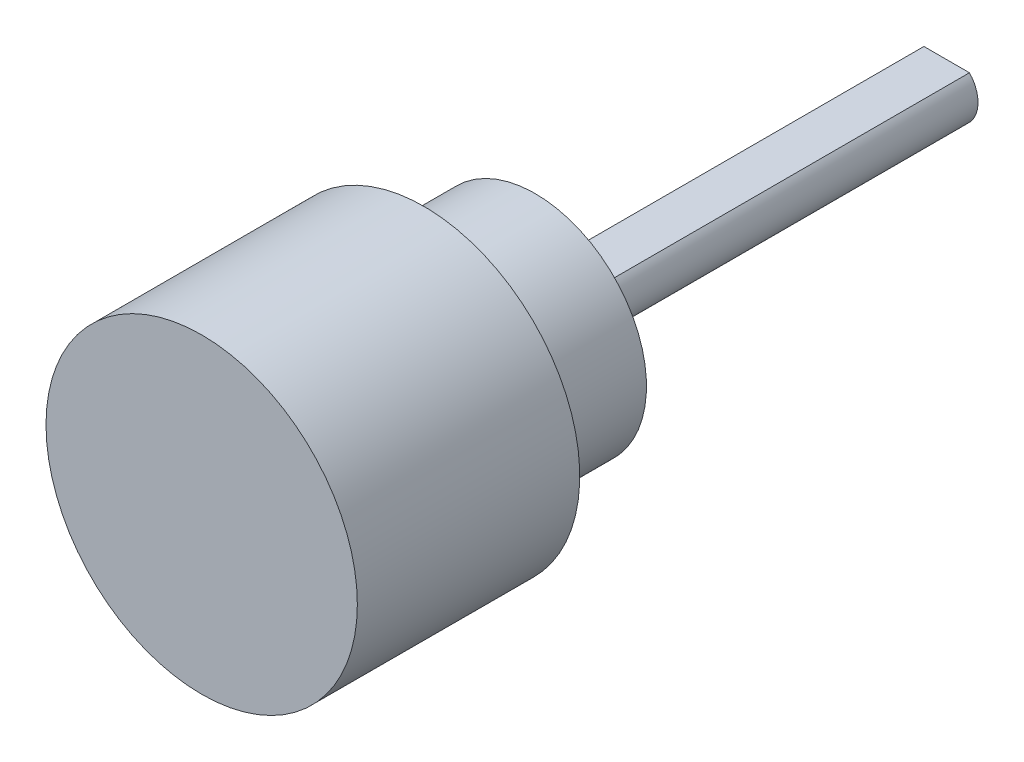
ISO-10303-21;
HEADER;
FILE_DESCRIPTION(('STEP AP214'),'2;1');
FILE_NAME('part.step','',(''),(''),'','','');
FILE_SCHEMA(('AUTOMOTIVE_DESIGN { 1 0 10303 214 1 1 1 1 }'));
ENDSEC;
DATA;
#1=APPLICATION_CONTEXT('core data for automotive mechanical design processes');
#2=APPLICATION_PROTOCOL_DEFINITION('international standard','automotive_design',2000,#1);
#3=PRODUCT_CONTEXT('',#1,'mechanical');
#4=PRODUCT('Part','Part','',(#3));
#5=PRODUCT_RELATED_PRODUCT_CATEGORY('part','',(#4));
#6=PRODUCT_DEFINITION_FORMATION('','',#4);
#7=PRODUCT_DEFINITION_CONTEXT('part definition',#1,'design');
#8=PRODUCT_DEFINITION('design','',#6,#7);
#9=PRODUCT_DEFINITION_SHAPE('','',#8);
#10=(LENGTH_UNIT() NAMED_UNIT(*) SI_UNIT(.MILLI.,.METRE.));
#11=(NAMED_UNIT(*) PLANE_ANGLE_UNIT() SI_UNIT($,.RADIAN.));
#12=(NAMED_UNIT(*) SI_UNIT($,.STERADIAN.) SOLID_ANGLE_UNIT());
#13=UNCERTAINTY_MEASURE_WITH_UNIT(LENGTH_MEASURE(1.E-05),#10,'distance_accuracy_value','');
#14=(GEOMETRIC_REPRESENTATION_CONTEXT(3) GLOBAL_UNCERTAINTY_ASSIGNED_CONTEXT((#13)) GLOBAL_UNIT_ASSIGNED_CONTEXT((#10,
#11,#12)) REPRESENTATION_CONTEXT('',''));
#15=CARTESIAN_POINT('',(0.,0.,0.));
#16=DIRECTION('',(0.,0.,1.));
#17=DIRECTION('',(1.,0.,0.));
#18=AXIS2_PLACEMENT_3D('',#15,#16,#17);
#19=CARTESIAN_POINT('',(0.,0.,-10.));
#20=DIRECTION('',(0.,0.,1.));
#21=DIRECTION('',(1.,0.,0.));
#22=AXIS2_PLACEMENT_3D('',#19,#20,#21);
#23=CYLINDRICAL_SURFACE('',#22,10.);
#24=CARTESIAN_POINT('',(0.,0.,-10.));
#25=DIRECTION('',(0.,0.,-1.));
#26=DIRECTION('',(-1.,0.,0.));
#27=AXIS2_PLACEMENT_3D('',#24,#25,#26);
#28=CIRCLE('',#27,10.);
#29=CARTESIAN_POINT('',(-10.,0.,-10.));
#30=VERTEX_POINT('',#29);
#31=EDGE_CURVE('E85',#30,#30,#28,.T.);
#32=ORIENTED_EDGE('',*,*,#31,.F.);
#33=EDGE_LOOP('',(#32));
#34=FACE_BOUND('',#33,.T.);
#35=CARTESIAN_POINT('',(0.,0.,0.));
#36=DIRECTION('',(0.,0.,-1.));
#37=DIRECTION('',(-1.,0.,0.));
#38=AXIS2_PLACEMENT_3D('',#35,#36,#37);
#39=CIRCLE('',#38,10.);
#40=CARTESIAN_POINT('',(-10.,0.,0.));
#41=VERTEX_POINT('',#40);
#42=EDGE_CURVE('E108',#41,#41,#39,.T.);
#43=ORIENTED_EDGE('',*,*,#42,.T.);
#44=EDGE_LOOP('',(#43));
#45=FACE_BOUND('',#44,.T.);
#46=ADVANCED_FACE('F46',(#34,#45),#23,.T.);
#47=CARTESIAN_POINT('',(0.,0.,-10.));
#48=DIRECTION('',(0.,0.,-1.));
#49=DIRECTION('',(-1.,0.,0.));
#50=AXIS2_PLACEMENT_3D('',#47,#48,#49);
#51=PLANE('',#50);
#52=DIRECTION('',(1.,0.,0.));
#53=VECTOR('',#52,1.);
#54=CARTESIAN_POINT('',(2.04774760924592,1.93331939387883,-10.));
#55=LINE('',#54,#53);
#56=CARTESIAN_POINT('',(-2.04774760924592,1.93331939387883,-10.));
#57=VERTEX_POINT('',#56);
#58=CARTESIAN_POINT('',(2.04774760924592,1.93331939387883,-10.));
#59=VERTEX_POINT('',#58);
#60=EDGE_CURVE('E61',#57,#59,#55,.T.);
#61=ORIENTED_EDGE('',*,*,#60,.F.);
#62=CARTESIAN_POINT('',(0.,0.,-10.));
#63=DIRECTION('',(0.,0.,-1.));
#64=DIRECTION('',(-1.,0.,0.));
#65=AXIS2_PLACEMENT_3D('',#62,#63,#64);
#66=CIRCLE('',#65,2.81620207902778);
#67=EDGE_CURVE('E11',#59,#57,#66,.T.);
#68=ORIENTED_EDGE('',*,*,#67,.F.);
#69=EDGE_LOOP('',(#61,#68));
#70=FACE_BOUND('',#69,.T.);
#71=ORIENTED_EDGE('',*,*,#31,.T.);
#72=EDGE_LOOP('',(#71));
#73=FACE_BOUND('',#72,.T.);
#74=ADVANCED_FACE('F72',(#70,#73),#51,.T.);
#75=CARTESIAN_POINT('',(0.,0.,-47.));
#76=DIRECTION('',(0.,0.,-1.));
#77=DIRECTION('',(-1.,0.,0.));
#78=AXIS2_PLACEMENT_3D('',#75,#76,#77);
#79=PLANE('',#78);
#80=CARTESIAN_POINT('',(0.,0.,-47.));
#81=DIRECTION('',(0.,0.,-1.));
#82=DIRECTION('',(-1.,0.,0.));
#83=AXIS2_PLACEMENT_3D('',#80,#81,#82);
#84=CIRCLE('',#83,2.81620207902778);
#85=CARTESIAN_POINT('',(2.04774760924592,1.93331939387883,-47.));
#86=VERTEX_POINT('',#85);
#87=CARTESIAN_POINT('',(-2.04774760924592,1.93331939387883,-47.));
#88=VERTEX_POINT('',#87);
#89=EDGE_CURVE('E84',#86,#88,#84,.T.);
#90=ORIENTED_EDGE('',*,*,#89,.T.);
#91=DIRECTION('',(1.,0.,0.));
#92=VECTOR('',#91,1.);
#93=CARTESIAN_POINT('',(2.04774760924592,1.93331939387883,-47.));
#94=LINE('',#93,#92);
#95=EDGE_CURVE('E67',#88,#86,#94,.T.);
#96=ORIENTED_EDGE('',*,*,#95,.T.);
#97=EDGE_LOOP('',(#90,#96));
#98=FACE_BOUND('',#97,.T.);
#99=ADVANCED_FACE('F117',(#98),#79,.T.);
#100=CARTESIAN_POINT('',(0.,0.,-47.));
#101=DIRECTION('',(0.,0.,1.));
#102=DIRECTION('',(1.,0.,0.));
#103=AXIS2_PLACEMENT_3D('',#100,#101,#102);
#104=CYLINDRICAL_SURFACE('',#103,2.81620207902778);
#105=DIRECTION('',(0.,0.,1.));
#106=VECTOR('',#105,1.);
#107=CARTESIAN_POINT('',(2.04774760924592,1.93331939387883,-47.));
#108=LINE('',#107,#106);
#109=EDGE_CURVE('E80',#86,#59,#108,.T.);
#110=ORIENTED_EDGE('',*,*,#109,.T.);
#111=ORIENTED_EDGE('',*,*,#67,.T.);
#112=DIRECTION('',(0.,0.,1.));
#113=VECTOR('',#112,1.);
#114=CARTESIAN_POINT('',(-2.04774760924592,1.93331939387883,-47.));
#115=LINE('',#114,#113);
#116=EDGE_CURVE('E82',#88,#57,#115,.T.);
#117=ORIENTED_EDGE('',*,*,#116,.F.);
#118=ORIENTED_EDGE('',*,*,#89,.F.);
#119=EDGE_LOOP('',(#110,#111,#117,#118));
#120=FACE_BOUND('',#119,.T.);
#121=ADVANCED_FACE('F87',(#120),#104,.T.);
#122=CARTESIAN_POINT('',(2.04774760924592,1.93331939387883,-47.));
#123=DIRECTION('',(0.,-1.,0.));
#124=DIRECTION('',(1.,0.,0.));
#125=AXIS2_PLACEMENT_3D('',#122,#123,#124);
#126=PLANE('',#125);
#127=ORIENTED_EDGE('',*,*,#116,.T.);
#128=ORIENTED_EDGE('',*,*,#60,.T.);
#129=ORIENTED_EDGE('',*,*,#109,.F.);
#130=ORIENTED_EDGE('',*,*,#95,.F.);
#131=EDGE_LOOP('',(#127,#128,#129,#130));
#132=FACE_BOUND('',#131,.T.);
#133=ADVANCED_FACE('F79',(#132),#126,.F.);
#134=CARTESIAN_POINT('',(0.,0.,0.));
#135=DIRECTION('',(0.,0.,-1.));
#136=DIRECTION('',(-1.,0.,0.));
#137=AXIS2_PLACEMENT_3D('',#134,#135,#136);
#138=PLANE('',#137);
#139=ORIENTED_EDGE('',*,*,#42,.F.);
#140=EDGE_LOOP('',(#139));
#141=FACE_BOUND('',#140,.T.);
#142=CARTESIAN_POINT('',(0.,0.,0.));
#143=DIRECTION('',(0.,0.,-1.));
#144=DIRECTION('',(-1.,0.,0.));
#145=AXIS2_PLACEMENT_3D('',#142,#143,#144);
#146=CIRCLE('',#145,14.);
#147=CARTESIAN_POINT('',(-14.,0.,0.));
#148=VERTEX_POINT('',#147);
#149=EDGE_CURVE('E105',#148,#148,#146,.T.);
#150=ORIENTED_EDGE('',*,*,#149,.T.);
#151=EDGE_LOOP('',(#150));
#152=FACE_BOUND('',#151,.T.);
#153=ADVANCED_FACE('F138',(#141,#152),#138,.T.);
#154=CARTESIAN_POINT('',(0.,0.,20.));
#155=DIRECTION('',(0.,0.,1.));
#156=DIRECTION('',(1.,0.,0.));
#157=AXIS2_PLACEMENT_3D('',#154,#155,#156);
#158=PLANE('',#157);
#159=CARTESIAN_POINT('',(0.,0.,20.));
#160=DIRECTION('',(0.,0.,1.));
#161=DIRECTION('',(1.,0.,0.));
#162=AXIS2_PLACEMENT_3D('',#159,#160,#161);
#163=CIRCLE('',#162,14.);
#164=CARTESIAN_POINT('',(14.,0.,20.));
#165=VERTEX_POINT('',#164);
#166=EDGE_CURVE('E55',#165,#165,#163,.T.);
#167=ORIENTED_EDGE('',*,*,#166,.T.);
#168=EDGE_LOOP('',(#167));
#169=FACE_BOUND('',#168,.T.);
#170=ADVANCED_FACE('F99',(#169),#158,.T.);
#171=CARTESIAN_POINT('',(0.,0.,20.));
#172=DIRECTION('',(0.,0.,-1.));
#173=DIRECTION('',(-1.,0.,0.));
#174=AXIS2_PLACEMENT_3D('',#171,#172,#173);
#175=CYLINDRICAL_SURFACE('',#174,14.);
#176=ORIENTED_EDGE('',*,*,#166,.F.);
#177=EDGE_LOOP('',(#176));
#178=FACE_BOUND('',#177,.T.);
#179=ORIENTED_EDGE('',*,*,#149,.F.);
#180=EDGE_LOOP('',(#179));
#181=FACE_BOUND('',#180,.T.);
#182=ADVANCED_FACE('F48',(#178,#181),#175,.T.);
#183=CLOSED_SHELL('',(#46,#74,#99,#121,#133,#153,#170,#182));
#184=MANIFOLD_SOLID_BREP('B2',#183);
#185=ADVANCED_BREP_SHAPE_REPRESENTATION('',(#18,#184),#14);
#186=SHAPE_DEFINITION_REPRESENTATION(#9,#185);
ENDSEC;
END-ISO-10303-21;
